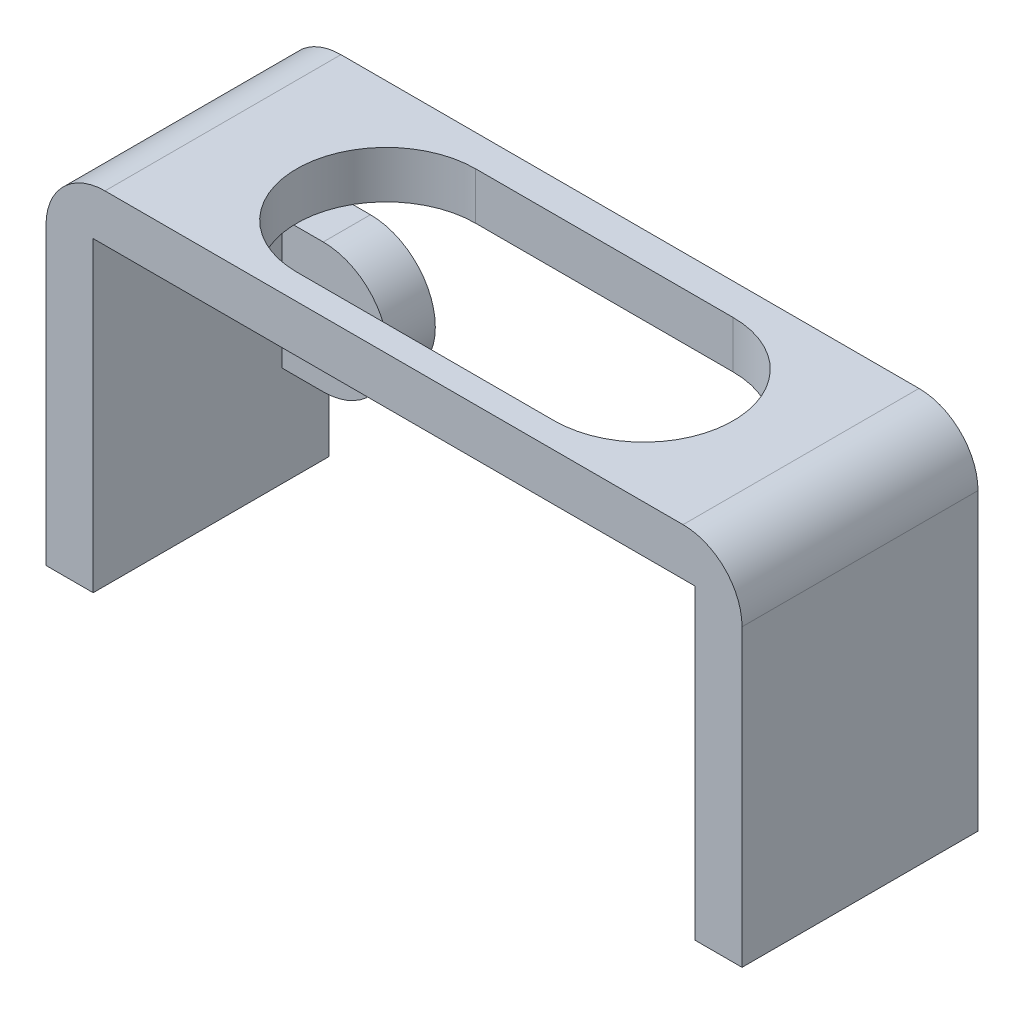
ISO-10303-21;
HEADER;
FILE_DESCRIPTION(('STEP AP214'),'2;1');
FILE_NAME('part.step','',(''),(''),'','','');
FILE_SCHEMA(('AUTOMOTIVE_DESIGN { 1 0 10303 214 1 1 1 1 }'));
ENDSEC;
DATA;
#1=APPLICATION_CONTEXT('core data for automotive mechanical design processes');
#2=APPLICATION_PROTOCOL_DEFINITION('international standard','automotive_design',2000,#1);
#3=PRODUCT_CONTEXT('',#1,'mechanical');
#4=PRODUCT('Part','Part','',(#3));
#5=PRODUCT_RELATED_PRODUCT_CATEGORY('part','',(#4));
#6=PRODUCT_DEFINITION_FORMATION('','',#4);
#7=PRODUCT_DEFINITION_CONTEXT('part definition',#1,'design');
#8=PRODUCT_DEFINITION('design','',#6,#7);
#9=PRODUCT_DEFINITION_SHAPE('','',#8);
#10=(LENGTH_UNIT() NAMED_UNIT(*) SI_UNIT(.MILLI.,.METRE.));
#11=(NAMED_UNIT(*) PLANE_ANGLE_UNIT() SI_UNIT($,.RADIAN.));
#12=(NAMED_UNIT(*) SI_UNIT($,.STERADIAN.) SOLID_ANGLE_UNIT());
#13=UNCERTAINTY_MEASURE_WITH_UNIT(LENGTH_MEASURE(1.E-05),#10,'distance_accuracy_value','');
#14=(GEOMETRIC_REPRESENTATION_CONTEXT(3) GLOBAL_UNCERTAINTY_ASSIGNED_CONTEXT((#13)) GLOBAL_UNIT_ASSIGNED_CONTEXT((#10,
#11,#12)) REPRESENTATION_CONTEXT('',''));
#15=CARTESIAN_POINT('',(0.,0.,0.));
#16=DIRECTION('',(0.,0.,1.));
#17=DIRECTION('',(1.,0.,0.));
#18=AXIS2_PLACEMENT_3D('',#15,#16,#17);
#19=CARTESIAN_POINT('',(0.,8.5,4.));
#20=DIRECTION('',(0.,-1.,0.));
#21=DIRECTION('',(1.,0.,0.));
#22=AXIS2_PLACEMENT_3D('',#19,#20,#21);
#23=PLANE('',#22);
#24=DIRECTION('',(0.,0.,1.));
#25=VECTOR('',#24,1.);
#26=CARTESIAN_POINT('',(4.,8.49999999999999,0.));
#27=LINE('',#26,#25);
#28=CARTESIAN_POINT('',(4.,8.49999999999999,0.));
#29=VERTEX_POINT('',#28);
#30=CARTESIAN_POINT('',(4.,8.49999999999999,4.));
#31=VERTEX_POINT('',#30);
#32=EDGE_CURVE('E263',#29,#31,#27,.T.);
#33=ORIENTED_EDGE('',*,*,#32,.F.);
#34=DIRECTION('',(-1.,0.,0.));
#35=VECTOR('',#34,1.);
#36=CARTESIAN_POINT('',(0.,8.5,0.));
#37=LINE('',#36,#35);
#38=CARTESIAN_POINT('',(7.5,8.49999999999999,0.));
#39=VERTEX_POINT('',#38);
#40=EDGE_CURVE('E348',#39,#29,#37,.T.);
#41=ORIENTED_EDGE('',*,*,#40,.F.);
#42=DIRECTION('',(0.,0.,-1.));
#43=VECTOR('',#42,1.);
#44=CARTESIAN_POINT('',(7.5,8.49999999999999,4.));
#45=LINE('',#44,#43);
#46=CARTESIAN_POINT('',(7.5,8.49999999999999,4.));
#47=VERTEX_POINT('',#46);
#48=EDGE_CURVE('E357',#47,#39,#45,.T.);
#49=ORIENTED_EDGE('',*,*,#48,.F.);
#50=DIRECTION('',(-1.,0.,0.));
#51=VECTOR('',#50,1.);
#52=CARTESIAN_POINT('',(0.,8.5,4.));
#53=LINE('',#52,#51);
#54=EDGE_CURVE('E335',#47,#31,#53,.T.);
#55=ORIENTED_EDGE('',*,*,#54,.T.);
#56=EDGE_LOOP('',(#33,#41,#49,#55));
#57=FACE_BOUND('',#56,.T.);
#58=ADVANCED_FACE('F45',(#57),#23,.T.);
#59=CARTESIAN_POINT('',(7.5,14.,4.));
#60=DIRECTION('',(0.,0.,-1.));
#61=DIRECTION('',(-1.,0.,0.));
#62=AXIS2_PLACEMENT_3D('',#59,#60,#61);
#63=CYLINDRICAL_SURFACE('',#62,5.5);
#64=CARTESIAN_POINT('',(7.5,14.,0.));
#65=DIRECTION('',(0.,0.,1.));
#66=DIRECTION('',(1.,0.,0.));
#67=AXIS2_PLACEMENT_3D('',#64,#65,#66);
#68=CIRCLE('',#67,5.5);
#69=CARTESIAN_POINT('',(7.5,19.5,0.));
#70=VERTEX_POINT('',#69);
#71=EDGE_CURVE('E351',#39,#70,#68,.T.);
#72=ORIENTED_EDGE('',*,*,#71,.T.);
#73=DIRECTION('',(0.,0.,-1.));
#74=VECTOR('',#73,1.);
#75=CARTESIAN_POINT('',(7.5,19.5,4.));
#76=LINE('',#75,#74);
#77=CARTESIAN_POINT('',(7.5,19.5,4.));
#78=VERTEX_POINT('',#77);
#79=EDGE_CURVE('E345',#78,#70,#76,.T.);
#80=ORIENTED_EDGE('',*,*,#79,.F.);
#81=CARTESIAN_POINT('',(7.5,14.,4.));
#82=DIRECTION('',(0.,0.,1.));
#83=DIRECTION('',(1.,0.,0.));
#84=AXIS2_PLACEMENT_3D('',#81,#82,#83);
#85=CIRCLE('',#84,5.5);
#86=EDGE_CURVE('E339',#47,#78,#85,.T.);
#87=ORIENTED_EDGE('',*,*,#86,.F.);
#88=ORIENTED_EDGE('',*,*,#48,.T.);
#89=EDGE_LOOP('',(#72,#80,#87,#88));
#90=FACE_BOUND('',#89,.T.);
#91=ADVANCED_FACE('F402',(#90),#63,.T.);
#92=CARTESIAN_POINT('',(0.,19.5,4.));
#93=DIRECTION('',(0.,-1.,0.));
#94=DIRECTION('',(1.,0.,0.));
#95=AXIS2_PLACEMENT_3D('',#92,#93,#94);
#96=PLANE('',#95);
#97=DIRECTION('',(-1.,0.,0.));
#98=VECTOR('',#97,1.);
#99=CARTESIAN_POINT('',(0.,19.5,0.));
#100=LINE('',#99,#98);
#101=CARTESIAN_POINT('',(4.,19.5,0.));
#102=VERTEX_POINT('',#101);
#103=EDGE_CURVE('E336',#70,#102,#100,.T.);
#104=ORIENTED_EDGE('',*,*,#103,.T.);
#105=DIRECTION('',(0.,0.,-1.));
#106=VECTOR('',#105,1.);
#107=CARTESIAN_POINT('',(4.,19.5,4.));
#108=LINE('',#107,#106);
#109=CARTESIAN_POINT('',(4.,19.5,4.));
#110=VERTEX_POINT('',#109);
#111=EDGE_CURVE('E245',#110,#102,#108,.T.);
#112=ORIENTED_EDGE('',*,*,#111,.F.);
#113=DIRECTION('',(-1.,0.,0.));
#114=VECTOR('',#113,1.);
#115=CARTESIAN_POINT('',(0.,19.5,4.));
#116=LINE('',#115,#114);
#117=EDGE_CURVE('E342',#78,#110,#116,.T.);
#118=ORIENTED_EDGE('',*,*,#117,.F.);
#119=ORIENTED_EDGE('',*,*,#79,.T.);
#120=EDGE_LOOP('',(#104,#112,#118,#119));
#121=FACE_BOUND('',#120,.T.);
#122=ADVANCED_FACE('F410',(#121),#96,.F.);
#123=CARTESIAN_POINT('',(7.5,14.,4.));
#124=DIRECTION('',(0.,0.,-1.));
#125=DIRECTION('',(-1.,0.,0.));
#126=AXIS2_PLACEMENT_3D('',#123,#124,#125);
#127=CYLINDRICAL_SURFACE('',#126,1.5);
#128=CARTESIAN_POINT('',(7.5,14.,4.));
#129=DIRECTION('',(0.,0.,1.));
#130=DIRECTION('',(1.,0.,0.));
#131=AXIS2_PLACEMENT_3D('',#128,#129,#130);
#132=CIRCLE('',#131,1.5);
#133=CARTESIAN_POINT('',(9.,14.,4.));
#134=VERTEX_POINT('',#133);
#135=EDGE_CURVE('E332',#134,#134,#132,.T.);
#136=ORIENTED_EDGE('',*,*,#135,.T.);
#137=EDGE_LOOP('',(#136));
#138=FACE_BOUND('',#137,.T.);
#139=CARTESIAN_POINT('',(7.5,14.,0.));
#140=DIRECTION('',(0.,0.,1.));
#141=DIRECTION('',(1.,0.,0.));
#142=AXIS2_PLACEMENT_3D('',#139,#140,#141);
#143=CIRCLE('',#142,1.5);
#144=CARTESIAN_POINT('',(9.,14.,0.));
#145=VERTEX_POINT('',#144);
#146=EDGE_CURVE('E331',#145,#145,#143,.T.);
#147=ORIENTED_EDGE('',*,*,#146,.F.);
#148=EDGE_LOOP('',(#147));
#149=FACE_BOUND('',#148,.T.);
#150=ADVANCED_FACE('F415',(#138,#149),#127,.F.);
#151=CARTESIAN_POINT('',(0.,0.,4.));
#152=DIRECTION('',(0.,0.,1.));
#153=DIRECTION('',(1.,0.,0.));
#154=AXIS2_PLACEMENT_3D('',#151,#152,#153);
#155=PLANE('',#154);
#156=DIRECTION('',(0.,1.,0.));
#157=VECTOR('',#156,1.);
#158=CARTESIAN_POINT('',(4.,8.49999999999999,4.));
#159=LINE('',#158,#157);
#160=EDGE_CURVE('E266',#31,#110,#159,.T.);
#161=ORIENTED_EDGE('',*,*,#160,.F.);
#162=ORIENTED_EDGE('',*,*,#54,.F.);
#163=ORIENTED_EDGE('',*,*,#86,.T.);
#164=ORIENTED_EDGE('',*,*,#117,.T.);
#165=EDGE_LOOP('',(#161,#162,#163,#164));
#166=FACE_BOUND('',#165,.T.);
#167=ORIENTED_EDGE('',*,*,#135,.F.);
#168=EDGE_LOOP('',(#167));
#169=FACE_BOUND('',#168,.T.);
#170=ADVANCED_FACE('F417',(#166,#169),#155,.T.);
#171=CARTESIAN_POINT('',(0.,0.,0.));
#172=DIRECTION('',(0.,0.,1.));
#173=DIRECTION('',(1.,0.,0.));
#174=AXIS2_PLACEMENT_3D('',#171,#172,#173);
#175=PLANE('',#174);
#176=DIRECTION('',(1.,0.,0.));
#177=VECTOR('',#176,1.);
#178=CARTESIAN_POINT('',(0.,0.,0.));
#179=LINE('',#178,#177);
#180=CARTESIAN_POINT('',(55.,0.,0.));
#181=VERTEX_POINT('',#180);
#182=CARTESIAN_POINT('',(59.,0.,0.));
#183=VERTEX_POINT('',#182);
#184=EDGE_CURVE('E300',#181,#183,#179,.T.);
#185=ORIENTED_EDGE('',*,*,#184,.F.);
#186=DIRECTION('',(0.,-1.,0.));
#187=VECTOR('',#186,1.);
#188=CARTESIAN_POINT('',(55.,8.5,0.));
#189=LINE('',#188,#187);
#190=CARTESIAN_POINT('',(55.,8.5,0.));
#191=VERTEX_POINT('',#190);
#192=EDGE_CURVE('E242',#191,#181,#189,.T.);
#193=ORIENTED_EDGE('',*,*,#192,.F.);
#194=DIRECTION('',(1.,0.,0.));
#195=VECTOR('',#194,1.);
#196=CARTESIAN_POINT('',(0.,8.5000000000001,0.));
#197=LINE('',#196,#195);
#198=CARTESIAN_POINT('',(51.5,8.5,0.));
#199=VERTEX_POINT('',#198);
#200=EDGE_CURVE('E290',#199,#191,#197,.T.);
#201=ORIENTED_EDGE('',*,*,#200,.F.);
#202=CARTESIAN_POINT('',(51.5,14.,0.));
#203=DIRECTION('',(0.,0.,1.));
#204=DIRECTION('',(1.,0.,0.));
#205=AXIS2_PLACEMENT_3D('',#202,#203,#204);
#206=CIRCLE('',#205,5.5);
#207=CARTESIAN_POINT('',(51.5,19.5,0.));
#208=VERTEX_POINT('',#207);
#209=EDGE_CURVE('E273',#199,#208,#206,.F.);
#210=ORIENTED_EDGE('',*,*,#209,.T.);
#211=DIRECTION('',(1.,0.,0.));
#212=VECTOR('',#211,1.);
#213=CARTESIAN_POINT('',(0.,19.5,0.));
#214=LINE('',#213,#212);
#215=CARTESIAN_POINT('',(55.,19.5,0.));
#216=VERTEX_POINT('',#215);
#217=EDGE_CURVE('E292',#208,#216,#214,.T.);
#218=ORIENTED_EDGE('',*,*,#217,.T.);
#219=DIRECTION('',(0.,-1.,0.));
#220=VECTOR('',#219,1.);
#221=CARTESIAN_POINT('',(55.,26.,0.));
#222=LINE('',#221,#220);
#223=CARTESIAN_POINT('',(55.,26.,0.));
#224=VERTEX_POINT('',#223);
#225=EDGE_CURVE('E230',#224,#216,#222,.T.);
#226=ORIENTED_EDGE('',*,*,#225,.F.);
#227=DIRECTION('',(1.,0.,0.));
#228=VECTOR('',#227,1.);
#229=CARTESIAN_POINT('',(2.,26.,0.));
#230=LINE('',#229,#228);
#231=CARTESIAN_POINT('',(4.,26.,0.));
#232=VERTEX_POINT('',#231);
#233=EDGE_CURVE('E269',#232,#224,#230,.T.);
#234=ORIENTED_EDGE('',*,*,#233,.F.);
#235=DIRECTION('',(0.,1.,0.));
#236=VECTOR('',#235,1.);
#237=CARTESIAN_POINT('',(4.,19.5,0.));
#238=LINE('',#237,#236);
#239=EDGE_CURVE('E248',#102,#232,#238,.T.);
#240=ORIENTED_EDGE('',*,*,#239,.F.);
#241=ORIENTED_EDGE('',*,*,#103,.F.);
#242=ORIENTED_EDGE('',*,*,#71,.F.);
#243=ORIENTED_EDGE('',*,*,#40,.T.);
#244=DIRECTION('',(0.,1.,0.));
#245=VECTOR('',#244,1.);
#246=CARTESIAN_POINT('',(4.,0.,0.));
#247=LINE('',#246,#245);
#248=CARTESIAN_POINT('',(4.,0.,0.));
#249=VERTEX_POINT('',#248);
#250=EDGE_CURVE('E260',#249,#29,#247,.T.);
#251=ORIENTED_EDGE('',*,*,#250,.F.);
#252=DIRECTION('',(1.,0.,0.));
#253=VECTOR('',#252,1.);
#254=CARTESIAN_POINT('',(0.,0.,0.));
#255=LINE('',#254,#253);
#256=CARTESIAN_POINT('',(0.,0.,0.));
#257=VERTEX_POINT('',#256);
#258=EDGE_CURVE('E305',#257,#249,#255,.T.);
#259=ORIENTED_EDGE('',*,*,#258,.F.);
#260=DIRECTION('',(0.,1.,0.));
#261=VECTOR('',#260,1.);
#262=CARTESIAN_POINT('',(0.,0.,0.));
#263=LINE('',#262,#261);
#264=CARTESIAN_POINT('',(0.,25.,0.));
#265=VERTEX_POINT('',#264);
#266=EDGE_CURVE('E323',#257,#265,#263,.T.);
#267=ORIENTED_EDGE('',*,*,#266,.T.);
#268=CARTESIAN_POINT('',(5.,25.,0.));
#269=DIRECTION('',(0.,0.,1.));
#270=DIRECTION('',(1.,0.,0.));
#271=AXIS2_PLACEMENT_3D('',#268,#269,#270);
#272=CIRCLE('',#271,5.);
#273=CARTESIAN_POINT('',(5.,30.,0.));
#274=VERTEX_POINT('',#273);
#275=EDGE_CURVE('E364',#265,#274,#272,.F.);
#276=ORIENTED_EDGE('',*,*,#275,.T.);
#277=DIRECTION('',(1.,0.,0.));
#278=VECTOR('',#277,1.);
#279=CARTESIAN_POINT('',(0.,30.,0.));
#280=LINE('',#279,#278);
#281=CARTESIAN_POINT('',(54.,30.,0.));
#282=VERTEX_POINT('',#281);
#283=EDGE_CURVE('E320',#274,#282,#280,.T.);
#284=ORIENTED_EDGE('',*,*,#283,.T.);
#285=CARTESIAN_POINT('',(54.,25.,0.));
#286=DIRECTION('',(0.,0.,1.));
#287=DIRECTION('',(1.,0.,0.));
#288=AXIS2_PLACEMENT_3D('',#285,#286,#287);
#289=CIRCLE('',#288,5.);
#290=CARTESIAN_POINT('',(59.,25.,0.));
#291=VERTEX_POINT('',#290);
#292=EDGE_CURVE('E366',#282,#291,#289,.F.);
#293=ORIENTED_EDGE('',*,*,#292,.T.);
#294=DIRECTION('',(0.,-1.,0.));
#295=VECTOR('',#294,1.);
#296=CARTESIAN_POINT('',(59.,0.,0.));
#297=LINE('',#296,#295);
#298=EDGE_CURVE('E318',#291,#183,#297,.T.);
#299=ORIENTED_EDGE('',*,*,#298,.T.);
#300=EDGE_LOOP('',(#185,#193,#201,#210,#218,#226,#234,#240,#241,#242,#243,#251,#259,#267,#276,
#284,#293,#299));
#301=FACE_BOUND('',#300,.T.);
#302=ORIENTED_EDGE('',*,*,#146,.T.);
#303=EDGE_LOOP('',(#302));
#304=FACE_BOUND('',#303,.T.);
#305=CARTESIAN_POINT('',(51.5,14.,0.));
#306=DIRECTION('',(0.,0.,1.));
#307=DIRECTION('',(1.,0.,0.));
#308=AXIS2_PLACEMENT_3D('',#305,#306,#307);
#309=CIRCLE('',#308,1.5);
#310=CARTESIAN_POINT('',(53.,14.,0.));
#311=VERTEX_POINT('',#310);
#312=EDGE_CURVE('E278',#311,#311,#309,.F.);
#313=ORIENTED_EDGE('',*,*,#312,.F.);
#314=EDGE_LOOP('',(#313));
#315=FACE_BOUND('',#314,.T.);
#316=ADVANCED_FACE('F460',(#301,#304,#315),#175,.F.);
#317=CARTESIAN_POINT('',(0.,0.,20.));
#318=DIRECTION('',(0.,1.,0.));
#319=DIRECTION('',(-1.,0.,0.));
#320=AXIS2_PLACEMENT_3D('',#317,#318,#319);
#321=PLANE('',#320);
#322=ORIENTED_EDGE('',*,*,#184,.T.);
#323=DIRECTION('',(0.,0.,-1.));
#324=VECTOR('',#323,1.);
#325=CARTESIAN_POINT('',(59.,0.,20.));
#326=LINE('',#325,#324);
#327=CARTESIAN_POINT('',(59.,0.,20.));
#328=VERTEX_POINT('',#327);
#329=EDGE_CURVE('E328',#328,#183,#326,.T.);
#330=ORIENTED_EDGE('',*,*,#329,.F.);
#331=DIRECTION('',(1.,0.,0.));
#332=VECTOR('',#331,1.);
#333=CARTESIAN_POINT('',(0.,0.,20.));
#334=LINE('',#333,#332);
#335=CARTESIAN_POINT('',(55.,0.,20.));
#336=VERTEX_POINT('',#335);
#337=EDGE_CURVE('E301',#336,#328,#334,.T.);
#338=ORIENTED_EDGE('',*,*,#337,.F.);
#339=DIRECTION('',(0.,0.,1.));
#340=VECTOR('',#339,1.);
#341=CARTESIAN_POINT('',(55.,0.,0.));
#342=LINE('',#341,#340);
#343=EDGE_CURVE('E219',#181,#336,#342,.T.);
#344=ORIENTED_EDGE('',*,*,#343,.F.);
#345=EDGE_LOOP('',(#322,#330,#338,#344));
#346=FACE_BOUND('',#345,.T.);
#347=ADVANCED_FACE('F467',(#346),#321,.F.);
#348=CARTESIAN_POINT('',(59.,0.,20.));
#349=DIRECTION('',(1.,0.,0.));
#350=DIRECTION('',(0.,1.,0.));
#351=AXIS2_PLACEMENT_3D('',#348,#349,#350);
#352=PLANE('',#351);
#353=ORIENTED_EDGE('',*,*,#298,.F.);
#354=DIRECTION('',(0.,0.,-1.));
#355=VECTOR('',#354,1.);
#356=CARTESIAN_POINT('',(59.,25.,20.));
#357=LINE('',#356,#355);
#358=CARTESIAN_POINT('',(59.,25.,20.));
#359=VERTEX_POINT('',#358);
#360=EDGE_CURVE('E368',#291,#359,#357,.F.);
#361=ORIENTED_EDGE('',*,*,#360,.T.);
#362=DIRECTION('',(0.,-1.,0.));
#363=VECTOR('',#362,1.);
#364=CARTESIAN_POINT('',(59.,0.,20.));
#365=LINE('',#364,#363);
#366=EDGE_CURVE('E304',#359,#328,#365,.T.);
#367=ORIENTED_EDGE('',*,*,#366,.T.);
#368=ORIENTED_EDGE('',*,*,#329,.T.);
#369=EDGE_LOOP('',(#353,#361,#367,#368));
#370=FACE_BOUND('',#369,.T.);
#371=ADVANCED_FACE('F470',(#370),#352,.T.);
#372=CARTESIAN_POINT('',(0.,30.,20.));
#373=DIRECTION('',(0.,1.,0.));
#374=DIRECTION('',(-1.,0.,0.));
#375=AXIS2_PLACEMENT_3D('',#372,#373,#374);
#376=PLANE('',#375);
#377=CARTESIAN_POINT('',(40.92,30.,10.2509236632287));
#378=DIRECTION('',(0.,1.,0.));
#379=DIRECTION('',(-1.,0.,0.));
#380=AXIS2_PLACEMENT_3D('',#377,#378,#379);
#381=CIRCLE('',#380,7.58193023435184);
#382=CARTESIAN_POINT('',(40.92,30.,17.8328538975805));
#383=VERTEX_POINT('',#382);
#384=CARTESIAN_POINT('',(40.92,30.,2.66899342887683));
#385=VERTEX_POINT('',#384);
#386=EDGE_CURVE('E60',#383,#385,#381,.T.);
#387=ORIENTED_EDGE('',*,*,#386,.F.);
#388=DIRECTION('',(1.,0.,0.));
#389=VECTOR('',#388,1.);
#390=CARTESIAN_POINT('',(40.92,30.,17.8328538975805));
#391=LINE('',#390,#389);
#392=CARTESIAN_POINT('',(19.0825525314889,30.,17.8328538975805));
#393=VERTEX_POINT('',#392);
#394=EDGE_CURVE('E212',#393,#383,#391,.T.);
#395=ORIENTED_EDGE('',*,*,#394,.F.);
#396=CARTESIAN_POINT('',(19.0825525314889,30.,10.2509236632287));
#397=DIRECTION('',(0.,1.,0.));
#398=DIRECTION('',(-1.,0.,0.));
#399=AXIS2_PLACEMENT_3D('',#396,#397,#398);
#400=CIRCLE('',#399,7.58193023435183);
#401=CARTESIAN_POINT('',(19.0825525314889,30.,2.66899342887683));
#402=VERTEX_POINT('',#401);
#403=EDGE_CURVE('E196',#402,#393,#400,.T.);
#404=ORIENTED_EDGE('',*,*,#403,.F.);
#405=DIRECTION('',(-1.,0.,0.));
#406=VECTOR('',#405,1.);
#407=CARTESIAN_POINT('',(40.92,30.,2.66899342887682));
#408=LINE('',#407,#406);
#409=EDGE_CURVE('E205',#385,#402,#408,.T.);
#410=ORIENTED_EDGE('',*,*,#409,.F.);
#411=EDGE_LOOP('',(#387,#395,#404,#410));
#412=FACE_BOUND('',#411,.T.);
#413=DIRECTION('',(1.,0.,0.));
#414=VECTOR('',#413,1.);
#415=CARTESIAN_POINT('',(0.,30.,20.));
#416=LINE('',#415,#414);
#417=CARTESIAN_POINT('',(5.,30.,20.));
#418=VERTEX_POINT('',#417);
#419=CARTESIAN_POINT('',(54.,30.,20.));
#420=VERTEX_POINT('',#419);
#421=EDGE_CURVE('E307',#418,#420,#416,.T.);
#422=ORIENTED_EDGE('',*,*,#421,.T.);
#423=DIRECTION('',(0.,0.,-1.));
#424=VECTOR('',#423,1.);
#425=CARTESIAN_POINT('',(54.,30.,20.));
#426=LINE('',#425,#424);
#427=EDGE_CURVE('E361',#420,#282,#426,.T.);
#428=ORIENTED_EDGE('',*,*,#427,.T.);
#429=ORIENTED_EDGE('',*,*,#283,.F.);
#430=DIRECTION('',(0.,0.,-1.));
#431=VECTOR('',#430,1.);
#432=CARTESIAN_POINT('',(5.,30.,20.));
#433=LINE('',#432,#431);
#434=EDGE_CURVE('E359',#274,#418,#433,.F.);
#435=ORIENTED_EDGE('',*,*,#434,.T.);
#436=EDGE_LOOP('',(#422,#428,#429,#435));
#437=FACE_BOUND('',#436,.T.);
#438=ADVANCED_FACE('F209',(#412,#437),#376,.T.);
#439=CARTESIAN_POINT('',(0.,0.,20.));
#440=DIRECTION('',(-1.,0.,0.));
#441=DIRECTION('',(0.,0.,1.));
#442=AXIS2_PLACEMENT_3D('',#439,#440,#441);
#443=PLANE('',#442);
#444=DIRECTION('',(0.,1.,0.));
#445=VECTOR('',#444,1.);
#446=CARTESIAN_POINT('',(0.,0.,20.));
#447=LINE('',#446,#445);
#448=CARTESIAN_POINT('',(0.,0.,20.));
#449=VERTEX_POINT('',#448);
#450=CARTESIAN_POINT('',(0.,25.,20.));
#451=VERTEX_POINT('',#450);
#452=EDGE_CURVE('E310',#449,#451,#447,.T.);
#453=ORIENTED_EDGE('',*,*,#452,.T.);
#454=DIRECTION('',(0.,0.,-1.));
#455=VECTOR('',#454,1.);
#456=CARTESIAN_POINT('',(0.,25.,20.));
#457=LINE('',#456,#455);
#458=EDGE_CURVE('E374',#451,#265,#457,.T.);
#459=ORIENTED_EDGE('',*,*,#458,.T.);
#460=ORIENTED_EDGE('',*,*,#266,.F.);
#461=DIRECTION('',(0.,0.,-1.));
#462=VECTOR('',#461,1.);
#463=CARTESIAN_POINT('',(0.,0.,20.));
#464=LINE('',#463,#462);
#465=EDGE_CURVE('E315',#449,#257,#464,.T.);
#466=ORIENTED_EDGE('',*,*,#465,.F.);
#467=EDGE_LOOP('',(#453,#459,#460,#466));
#468=FACE_BOUND('',#467,.T.);
#469=ADVANCED_FACE('F445',(#468),#443,.T.);
#470=CARTESIAN_POINT('',(0.,0.,20.));
#471=DIRECTION('',(0.,1.,0.));
#472=DIRECTION('',(0.,0.,1.));
#473=AXIS2_PLACEMENT_3D('',#470,#471,#472);
#474=PLANE('',#473);
#475=ORIENTED_EDGE('',*,*,#258,.T.);
#476=DIRECTION('',(0.,0.,-1.));
#477=VECTOR('',#476,1.);
#478=CARTESIAN_POINT('',(4.,0.,20.));
#479=LINE('',#478,#477);
#480=CARTESIAN_POINT('',(4.,0.,20.));
#481=VERTEX_POINT('',#480);
#482=EDGE_CURVE('E257',#481,#249,#479,.T.);
#483=ORIENTED_EDGE('',*,*,#482,.F.);
#484=DIRECTION('',(1.,0.,0.));
#485=VECTOR('',#484,1.);
#486=CARTESIAN_POINT('',(0.,0.,20.));
#487=LINE('',#486,#485);
#488=EDGE_CURVE('E313',#449,#481,#487,.T.);
#489=ORIENTED_EDGE('',*,*,#488,.F.);
#490=ORIENTED_EDGE('',*,*,#465,.T.);
#491=EDGE_LOOP('',(#475,#483,#489,#490));
#492=FACE_BOUND('',#491,.T.);
#493=ADVANCED_FACE('F451',(#492),#474,.F.);
#494=CARTESIAN_POINT('',(0.,0.,20.));
#495=DIRECTION('',(0.,0.,1.));
#496=DIRECTION('',(1.,0.,0.));
#497=AXIS2_PLACEMENT_3D('',#494,#495,#496);
#498=PLANE('',#497);
#499=DIRECTION('',(0.,1.,0.));
#500=VECTOR('',#499,1.);
#501=CARTESIAN_POINT('',(55.,0.,20.));
#502=LINE('',#501,#500);
#503=CARTESIAN_POINT('',(55.,26.,20.));
#504=VERTEX_POINT('',#503);
#505=EDGE_CURVE('E224',#336,#504,#502,.T.);
#506=ORIENTED_EDGE('',*,*,#505,.F.);
#507=ORIENTED_EDGE('',*,*,#337,.T.);
#508=ORIENTED_EDGE('',*,*,#366,.F.);
#509=CARTESIAN_POINT('',(54.,25.,20.));
#510=DIRECTION('',(0.,0.,1.));
#511=DIRECTION('',(1.,0.,0.));
#512=AXIS2_PLACEMENT_3D('',#509,#510,#511);
#513=CIRCLE('',#512,5.);
#514=EDGE_CURVE('E372',#359,#420,#513,.T.);
#515=ORIENTED_EDGE('',*,*,#514,.T.);
#516=ORIENTED_EDGE('',*,*,#421,.F.);
#517=CARTESIAN_POINT('',(5.,25.,20.));
#518=DIRECTION('',(0.,0.,1.));
#519=DIRECTION('',(1.,0.,0.));
#520=AXIS2_PLACEMENT_3D('',#517,#518,#519);
#521=CIRCLE('',#520,5.);
#522=EDGE_CURVE('E370',#418,#451,#521,.T.);
#523=ORIENTED_EDGE('',*,*,#522,.T.);
#524=ORIENTED_EDGE('',*,*,#452,.F.);
#525=ORIENTED_EDGE('',*,*,#488,.T.);
#526=DIRECTION('',(0.,-1.,0.));
#527=VECTOR('',#526,1.);
#528=CARTESIAN_POINT('',(4.,26.,20.));
#529=LINE('',#528,#527);
#530=CARTESIAN_POINT('',(4.,26.,20.));
#531=VERTEX_POINT('',#530);
#532=EDGE_CURVE('E254',#531,#481,#529,.T.);
#533=ORIENTED_EDGE('',*,*,#532,.F.);
#534=DIRECTION('',(-1.,0.,0.));
#535=VECTOR('',#534,1.);
#536=CARTESIAN_POINT('',(57.,26.,20.));
#537=LINE('',#536,#535);
#538=EDGE_CURVE('E271',#504,#531,#537,.T.);
#539=ORIENTED_EDGE('',*,*,#538,.F.);
#540=EDGE_LOOP('',(#506,#507,#508,#515,#516,#523,#524,#525,#533,#539));
#541=FACE_BOUND('',#540,.T.);
#542=ADVANCED_FACE('F438',(#541),#498,.T.);
#543=CARTESIAN_POINT('',(51.5,14.,4.));
#544=DIRECTION('',(0.,0.,-1.));
#545=DIRECTION('',(-1.,0.,0.));
#546=AXIS2_PLACEMENT_3D('',#543,#544,#545);
#547=CYLINDRICAL_SURFACE('',#546,5.5);
#548=ORIENTED_EDGE('',*,*,#209,.F.);
#549=DIRECTION('',(0.,0.,-1.));
#550=VECTOR('',#549,1.);
#551=CARTESIAN_POINT('',(51.5,8.5,4.));
#552=LINE('',#551,#550);
#553=CARTESIAN_POINT('',(51.5,8.5,4.));
#554=VERTEX_POINT('',#553);
#555=EDGE_CURVE('E298',#554,#199,#552,.T.);
#556=ORIENTED_EDGE('',*,*,#555,.F.);
#557=CARTESIAN_POINT('',(51.5,14.,4.));
#558=DIRECTION('',(0.,0.,1.));
#559=DIRECTION('',(1.,0.,0.));
#560=AXIS2_PLACEMENT_3D('',#557,#558,#559);
#561=CIRCLE('',#560,5.5);
#562=CARTESIAN_POINT('',(51.5,19.5,4.));
#563=VERTEX_POINT('',#562);
#564=EDGE_CURVE('E274',#554,#563,#561,.F.);
#565=ORIENTED_EDGE('',*,*,#564,.T.);
#566=DIRECTION('',(0.,0.,-1.));
#567=VECTOR('',#566,1.);
#568=CARTESIAN_POINT('',(51.5,19.5,4.));
#569=LINE('',#568,#567);
#570=EDGE_CURVE('E287',#563,#208,#569,.T.);
#571=ORIENTED_EDGE('',*,*,#570,.T.);
#572=EDGE_LOOP('',(#548,#556,#565,#571));
#573=FACE_BOUND('',#572,.T.);
#574=ADVANCED_FACE('F497',(#573),#547,.T.);
#575=CARTESIAN_POINT('',(0.,8.5000000000001,4.));
#576=DIRECTION('',(0.,1.,0.));
#577=DIRECTION('',(-1.,0.,0.));
#578=AXIS2_PLACEMENT_3D('',#575,#576,#577);
#579=PLANE('',#578);
#580=ORIENTED_EDGE('',*,*,#200,.T.);
#581=DIRECTION('',(0.,0.,-1.));
#582=VECTOR('',#581,1.);
#583=CARTESIAN_POINT('',(55.,8.5,4.));
#584=LINE('',#583,#582);
#585=CARTESIAN_POINT('',(55.,8.5,4.));
#586=VERTEX_POINT('',#585);
#587=EDGE_CURVE('E239',#586,#191,#584,.T.);
#588=ORIENTED_EDGE('',*,*,#587,.F.);
#589=DIRECTION('',(1.,0.,0.));
#590=VECTOR('',#589,1.);
#591=CARTESIAN_POINT('',(0.,8.5000000000001,4.));
#592=LINE('',#591,#590);
#593=EDGE_CURVE('E277',#554,#586,#592,.T.);
#594=ORIENTED_EDGE('',*,*,#593,.F.);
#595=ORIENTED_EDGE('',*,*,#555,.T.);
#596=EDGE_LOOP('',(#580,#588,#594,#595));
#597=FACE_BOUND('',#596,.T.);
#598=ADVANCED_FACE('F500',(#597),#579,.F.);
#599=CARTESIAN_POINT('',(0.,19.5,4.));
#600=DIRECTION('',(0.,1.,0.));
#601=DIRECTION('',(0.,0.,1.));
#602=AXIS2_PLACEMENT_3D('',#599,#600,#601);
#603=PLANE('',#602);
#604=DIRECTION('',(0.,0.,1.));
#605=VECTOR('',#604,1.);
#606=CARTESIAN_POINT('',(55.,19.5,0.));
#607=LINE('',#606,#605);
#608=CARTESIAN_POINT('',(55.,19.5,4.));
#609=VERTEX_POINT('',#608);
#610=EDGE_CURVE('E233',#216,#609,#607,.T.);
#611=ORIENTED_EDGE('',*,*,#610,.F.);
#612=ORIENTED_EDGE('',*,*,#217,.F.);
#613=ORIENTED_EDGE('',*,*,#570,.F.);
#614=DIRECTION('',(1.,0.,0.));
#615=VECTOR('',#614,1.);
#616=CARTESIAN_POINT('',(0.,19.5,4.));
#617=LINE('',#616,#615);
#618=EDGE_CURVE('E281',#563,#609,#617,.T.);
#619=ORIENTED_EDGE('',*,*,#618,.T.);
#620=EDGE_LOOP('',(#611,#612,#613,#619));
#621=FACE_BOUND('',#620,.T.);
#622=ADVANCED_FACE('F504',(#621),#603,.T.);
#623=CARTESIAN_POINT('',(51.5,14.,4.));
#624=DIRECTION('',(0.,0.,-1.));
#625=DIRECTION('',(-1.,0.,0.));
#626=AXIS2_PLACEMENT_3D('',#623,#624,#625);
#627=CYLINDRICAL_SURFACE('',#626,1.5);
#628=CARTESIAN_POINT('',(51.5,14.,4.));
#629=DIRECTION('',(0.,0.,1.));
#630=DIRECTION('',(1.,0.,0.));
#631=AXIS2_PLACEMENT_3D('',#628,#629,#630);
#632=CIRCLE('',#631,1.5);
#633=CARTESIAN_POINT('',(53.,14.,4.));
#634=VERTEX_POINT('',#633);
#635=EDGE_CURVE('E284',#634,#634,#632,.F.);
#636=ORIENTED_EDGE('',*,*,#635,.F.);
#637=EDGE_LOOP('',(#636));
#638=FACE_BOUND('',#637,.T.);
#639=ORIENTED_EDGE('',*,*,#312,.T.);
#640=EDGE_LOOP('',(#639));
#641=FACE_BOUND('',#640,.T.);
#642=ADVANCED_FACE('F428',(#638,#641),#627,.F.);
#643=CARTESIAN_POINT('',(0.,0.,4.));
#644=DIRECTION('',(0.,0.,1.));
#645=DIRECTION('',(1.,0.,0.));
#646=AXIS2_PLACEMENT_3D('',#643,#644,#645);
#647=PLANE('',#646);
#648=DIRECTION('',(0.,-1.,0.));
#649=VECTOR('',#648,1.);
#650=CARTESIAN_POINT('',(55.,19.5,4.));
#651=LINE('',#650,#649);
#652=EDGE_CURVE('E236',#609,#586,#651,.T.);
#653=ORIENTED_EDGE('',*,*,#652,.F.);
#654=ORIENTED_EDGE('',*,*,#618,.F.);
#655=ORIENTED_EDGE('',*,*,#564,.F.);
#656=ORIENTED_EDGE('',*,*,#593,.T.);
#657=EDGE_LOOP('',(#653,#654,#655,#656));
#658=FACE_BOUND('',#657,.T.);
#659=ORIENTED_EDGE('',*,*,#635,.T.);
#660=EDGE_LOOP('',(#659));
#661=FACE_BOUND('',#660,.T.);
#662=ADVANCED_FACE('F421',(#658,#661),#647,.T.);
#663=CARTESIAN_POINT('',(54.,25.,20.));
#664=DIRECTION('',(0.,0.,-1.));
#665=DIRECTION('',(-1.,0.,0.));
#666=AXIS2_PLACEMENT_3D('',#663,#664,#665);
#667=CYLINDRICAL_SURFACE('',#666,5.);
#668=ORIENTED_EDGE('',*,*,#514,.F.);
#669=ORIENTED_EDGE('',*,*,#360,.F.);
#670=ORIENTED_EDGE('',*,*,#292,.F.);
#671=ORIENTED_EDGE('',*,*,#427,.F.);
#672=EDGE_LOOP('',(#668,#669,#670,#671));
#673=FACE_BOUND('',#672,.T.);
#674=ADVANCED_FACE('F419',(#673),#667,.T.);
#675=CARTESIAN_POINT('',(5.,25.,20.));
#676=DIRECTION('',(0.,0.,-1.));
#677=DIRECTION('',(-1.,0.,0.));
#678=AXIS2_PLACEMENT_3D('',#675,#676,#677);
#679=CYLINDRICAL_SURFACE('',#678,5.);
#680=ORIENTED_EDGE('',*,*,#522,.F.);
#681=ORIENTED_EDGE('',*,*,#434,.F.);
#682=ORIENTED_EDGE('',*,*,#275,.F.);
#683=ORIENTED_EDGE('',*,*,#458,.F.);
#684=EDGE_LOOP('',(#680,#681,#682,#683));
#685=FACE_BOUND('',#684,.T.);
#686=ADVANCED_FACE('F47',(#685),#679,.T.);
#687=CARTESIAN_POINT('',(0.,26.,0.));
#688=DIRECTION('',(0.,-1.,0.));
#689=DIRECTION('',(0.,0.,-1.));
#690=AXIS2_PLACEMENT_3D('',#687,#688,#689);
#691=PLANE('',#690);
#692=CARTESIAN_POINT('',(40.92,26.,10.2509236632287));
#693=DIRECTION('',(0.,-1.,0.));
#694=DIRECTION('',(0.,0.,-1.));
#695=AXIS2_PLACEMENT_3D('',#692,#693,#694);
#696=CIRCLE('',#695,7.58193023435184);
#697=CARTESIAN_POINT('',(40.92,26.,2.66899342887682));
#698=VERTEX_POINT('',#697);
#699=CARTESIAN_POINT('',(40.92,26.,17.8328538975805));
#700=VERTEX_POINT('',#699);
#701=EDGE_CURVE('E11',#698,#700,#696,.T.);
#702=ORIENTED_EDGE('',*,*,#701,.F.);
#703=DIRECTION('',(1.,0.,0.));
#704=VECTOR('',#703,1.);
#705=CARTESIAN_POINT('',(0.,26.,2.66899342887684));
#706=LINE('',#705,#704);
#707=CARTESIAN_POINT('',(19.0825525314889,26.,2.66899342887683));
#708=VERTEX_POINT('',#707);
#709=EDGE_CURVE('E377',#708,#698,#706,.T.);
#710=ORIENTED_EDGE('',*,*,#709,.F.);
#711=CARTESIAN_POINT('',(19.0825525314889,26.,10.2509236632287));
#712=DIRECTION('',(0.,-1.,0.));
#713=DIRECTION('',(0.,0.,-1.));
#714=AXIS2_PLACEMENT_3D('',#711,#712,#713);
#715=CIRCLE('',#714,7.58193023435183);
#716=CARTESIAN_POINT('',(19.0825525314889,26.,17.8328538975805));
#717=VERTEX_POINT('',#716);
#718=EDGE_CURVE('E199',#717,#708,#715,.T.);
#719=ORIENTED_EDGE('',*,*,#718,.F.);
#720=DIRECTION('',(-1.,0.,0.));
#721=VECTOR('',#720,1.);
#722=CARTESIAN_POINT('',(0.,26.,17.8328538975805));
#723=LINE('',#722,#721);
#724=EDGE_CURVE('E53',#700,#717,#723,.T.);
#725=ORIENTED_EDGE('',*,*,#724,.F.);
#726=EDGE_LOOP('',(#702,#710,#719,#725));
#727=FACE_BOUND('',#726,.T.);
#728=DIRECTION('',(0.,0.,-1.));
#729=VECTOR('',#728,1.);
#730=CARTESIAN_POINT('',(55.,26.,20.));
#731=LINE('',#730,#729);
#732=EDGE_CURVE('E227',#504,#224,#731,.T.);
#733=ORIENTED_EDGE('',*,*,#732,.F.);
#734=ORIENTED_EDGE('',*,*,#538,.T.);
#735=DIRECTION('',(0.,0.,1.));
#736=VECTOR('',#735,1.);
#737=CARTESIAN_POINT('',(4.,26.,0.));
#738=LINE('',#737,#736);
#739=EDGE_CURVE('E251',#232,#531,#738,.T.);
#740=ORIENTED_EDGE('',*,*,#739,.F.);
#741=ORIENTED_EDGE('',*,*,#233,.T.);
#742=EDGE_LOOP('',(#733,#734,#740,#741));
#743=FACE_BOUND('',#742,.T.);
#744=ADVANCED_FACE('F385',(#727,#743),#691,.T.);
#745=CARTESIAN_POINT('',(4.,0.,0.));
#746=DIRECTION('',(1.,0.,0.));
#747=DIRECTION('',(0.,0.,-1.));
#748=AXIS2_PLACEMENT_3D('',#745,#746,#747);
#749=PLANE('',#748);
#750=ORIENTED_EDGE('',*,*,#111,.T.);
#751=ORIENTED_EDGE('',*,*,#239,.T.);
#752=ORIENTED_EDGE('',*,*,#739,.T.);
#753=ORIENTED_EDGE('',*,*,#532,.T.);
#754=ORIENTED_EDGE('',*,*,#482,.T.);
#755=ORIENTED_EDGE('',*,*,#250,.T.);
#756=ORIENTED_EDGE('',*,*,#32,.T.);
#757=ORIENTED_EDGE('',*,*,#160,.T.);
#758=EDGE_LOOP('',(#750,#751,#752,#753,#754,#755,#756,#757));
#759=FACE_BOUND('',#758,.T.);
#760=ADVANCED_FACE('F397',(#759),#749,.T.);
#761=CARTESIAN_POINT('',(55.,0.,0.));
#762=DIRECTION('',(-1.,0.,0.));
#763=DIRECTION('',(0.,0.,1.));
#764=AXIS2_PLACEMENT_3D('',#761,#762,#763);
#765=PLANE('',#764);
#766=ORIENTED_EDGE('',*,*,#343,.T.);
#767=ORIENTED_EDGE('',*,*,#505,.T.);
#768=ORIENTED_EDGE('',*,*,#732,.T.);
#769=ORIENTED_EDGE('',*,*,#225,.T.);
#770=ORIENTED_EDGE('',*,*,#610,.T.);
#771=ORIENTED_EDGE('',*,*,#652,.T.);
#772=ORIENTED_EDGE('',*,*,#587,.T.);
#773=ORIENTED_EDGE('',*,*,#192,.T.);
#774=EDGE_LOOP('',(#766,#767,#768,#769,#770,#771,#772,#773));
#775=FACE_BOUND('',#774,.T.);
#776=ADVANCED_FACE('F389',(#775),#765,.T.);
#777=CARTESIAN_POINT('',(40.92,23.,10.2509236632287));
#778=DIRECTION('',(0.,1.,0.));
#779=DIRECTION('',(-1.,0.,0.));
#780=AXIS2_PLACEMENT_3D('',#777,#778,#779);
#781=CYLINDRICAL_SURFACE('',#780,7.58193023435184);
#782=ORIENTED_EDGE('',*,*,#701,.T.);
#783=DIRECTION('',(0.,1.,0.));
#784=VECTOR('',#783,1.);
#785=CARTESIAN_POINT('',(40.92,23.,17.8328538975805));
#786=LINE('',#785,#784);
#787=EDGE_CURVE('E217',#700,#383,#786,.T.);
#788=ORIENTED_EDGE('',*,*,#787,.T.);
#789=ORIENTED_EDGE('',*,*,#386,.T.);
#790=DIRECTION('',(0.,1.,0.));
#791=VECTOR('',#790,1.);
#792=CARTESIAN_POINT('',(40.92,23.,2.66899342887682));
#793=LINE('',#792,#791);
#794=EDGE_CURVE('E202',#698,#385,#793,.T.);
#795=ORIENTED_EDGE('',*,*,#794,.F.);
#796=EDGE_LOOP('',(#782,#788,#789,#795));
#797=FACE_BOUND('',#796,.T.);
#798=ADVANCED_FACE('F387',(#797),#781,.F.);
#799=CARTESIAN_POINT('',(40.92,23.,17.8328538975805));
#800=DIRECTION('',(0.,0.,1.));
#801=DIRECTION('',(1.,0.,0.));
#802=AXIS2_PLACEMENT_3D('',#799,#800,#801);
#803=PLANE('',#802);
#804=ORIENTED_EDGE('',*,*,#724,.T.);
#805=DIRECTION('',(0.,1.,0.));
#806=VECTOR('',#805,1.);
#807=CARTESIAN_POINT('',(19.0825525314889,23.,17.8328538975805));
#808=LINE('',#807,#806);
#809=EDGE_CURVE('E201',#717,#393,#808,.T.);
#810=ORIENTED_EDGE('',*,*,#809,.T.);
#811=ORIENTED_EDGE('',*,*,#394,.T.);
#812=ORIENTED_EDGE('',*,*,#787,.F.);
#813=EDGE_LOOP('',(#804,#810,#811,#812));
#814=FACE_BOUND('',#813,.T.);
#815=ADVANCED_FACE('F382',(#814),#803,.F.);
#816=CARTESIAN_POINT('',(19.0825525314889,23.,10.2509236632287));
#817=DIRECTION('',(0.,1.,0.));
#818=DIRECTION('',(-1.,0.,0.));
#819=AXIS2_PLACEMENT_3D('',#816,#817,#818);
#820=CYLINDRICAL_SURFACE('',#819,7.58193023435183);
#821=ORIENTED_EDGE('',*,*,#718,.T.);
#822=DIRECTION('',(0.,1.,0.));
#823=VECTOR('',#822,1.);
#824=CARTESIAN_POINT('',(19.0825525314889,23.,2.66899342887683));
#825=LINE('',#824,#823);
#826=EDGE_CURVE('E68',#708,#402,#825,.T.);
#827=ORIENTED_EDGE('',*,*,#826,.T.);
#828=ORIENTED_EDGE('',*,*,#403,.T.);
#829=ORIENTED_EDGE('',*,*,#809,.F.);
#830=EDGE_LOOP('',(#821,#827,#828,#829));
#831=FACE_BOUND('',#830,.T.);
#832=ADVANCED_FACE('F193',(#831),#820,.F.);
#833=CARTESIAN_POINT('',(40.92,23.,2.66899342887682));
#834=DIRECTION('',(0.,0.,-1.));
#835=DIRECTION('',(-1.,0.,0.));
#836=AXIS2_PLACEMENT_3D('',#833,#834,#835);
#837=PLANE('',#836);
#838=ORIENTED_EDGE('',*,*,#709,.T.);
#839=ORIENTED_EDGE('',*,*,#794,.T.);
#840=ORIENTED_EDGE('',*,*,#409,.T.);
#841=ORIENTED_EDGE('',*,*,#826,.F.);
#842=EDGE_LOOP('',(#838,#839,#840,#841));
#843=FACE_BOUND('',#842,.T.);
#844=ADVANCED_FACE('F206',(#843),#837,.F.);
#845=CLOSED_SHELL('',(#58,#91,#122,#150,#170,#316,#347,#371,#438,#469,#493,#542,#574,#598,#622,
#642,#662,#674,#686,#744,#760,#776,#798,#815,#832,#844));
#846=MANIFOLD_SOLID_BREP('B2',#845);
#847=ADVANCED_BREP_SHAPE_REPRESENTATION('',(#18,#846),#14);
#848=SHAPE_DEFINITION_REPRESENTATION(#9,#847);
ENDSEC;
END-ISO-10303-21;
